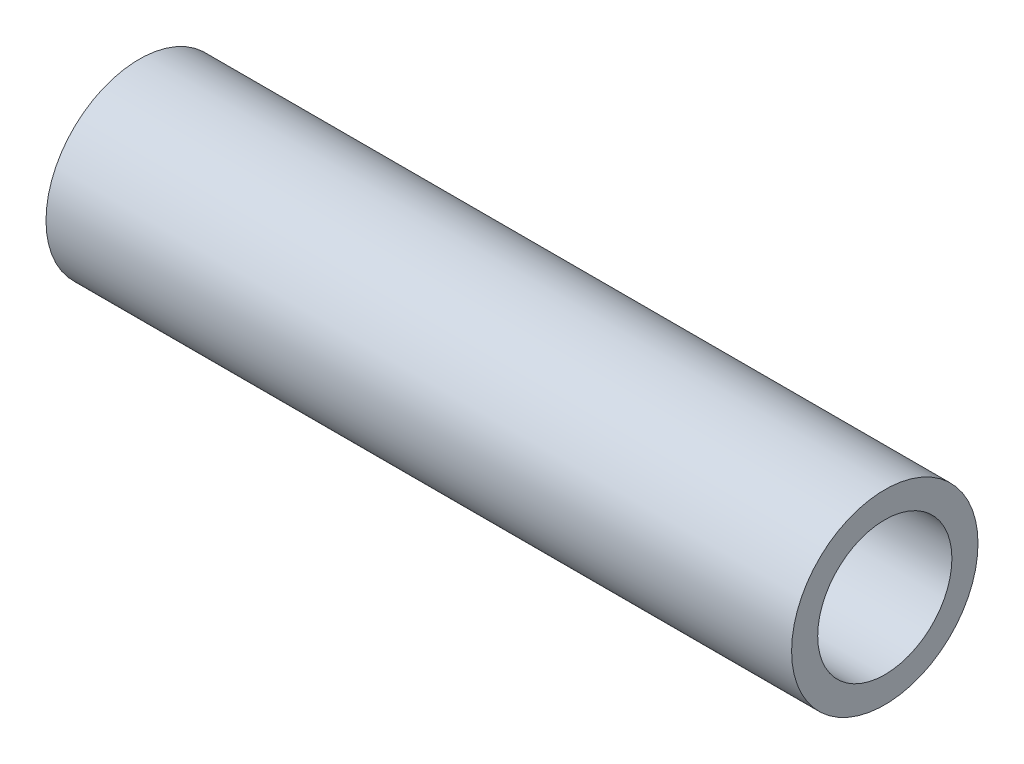
ISO-10303-21;
HEADER;
FILE_DESCRIPTION(('STEP AP214'),'2;1');
FILE_NAME('part.step','',(''),(''),'','','');
FILE_SCHEMA(('AUTOMOTIVE_DESIGN { 1 0 10303 214 1 1 1 1 }'));
ENDSEC;
DATA;
#1=APPLICATION_CONTEXT('core data for automotive mechanical design processes');
#2=APPLICATION_PROTOCOL_DEFINITION('international standard','automotive_design',2000,#1);
#3=PRODUCT_CONTEXT('',#1,'mechanical');
#4=PRODUCT('Part','Part','',(#3));
#5=PRODUCT_RELATED_PRODUCT_CATEGORY('part','',(#4));
#6=PRODUCT_DEFINITION_FORMATION('','',#4);
#7=PRODUCT_DEFINITION_CONTEXT('part definition',#1,'design');
#8=PRODUCT_DEFINITION('design','',#6,#7);
#9=PRODUCT_DEFINITION_SHAPE('','',#8);
#10=(LENGTH_UNIT() NAMED_UNIT(*) SI_UNIT(.MILLI.,.METRE.));
#11=(NAMED_UNIT(*) PLANE_ANGLE_UNIT() SI_UNIT($,.RADIAN.));
#12=(NAMED_UNIT(*) SI_UNIT($,.STERADIAN.) SOLID_ANGLE_UNIT());
#13=UNCERTAINTY_MEASURE_WITH_UNIT(LENGTH_MEASURE(1.E-05),#10,'distance_accuracy_value','');
#14=(GEOMETRIC_REPRESENTATION_CONTEXT(3) GLOBAL_UNCERTAINTY_ASSIGNED_CONTEXT((#13)) GLOBAL_UNIT_ASSIGNED_CONTEXT((#10,
#11,#12)) REPRESENTATION_CONTEXT('',''));
#15=CARTESIAN_POINT('',(0.,0.,0.));
#16=DIRECTION('',(0.,0.,1.));
#17=DIRECTION('',(1.,0.,0.));
#18=AXIS2_PLACEMENT_3D('',#15,#16,#17);
#19=CARTESIAN_POINT('',(20.,0.,0.));
#20=DIRECTION('',(-1.,0.,0.));
#21=DIRECTION('',(0.,0.,1.));
#22=AXIS2_PLACEMENT_3D('',#19,#20,#21);
#23=CYLINDRICAL_SURFACE('',#22,2.5);
#24=CARTESIAN_POINT('',(20.,0.,0.));
#25=DIRECTION('',(1.,0.,0.));
#26=DIRECTION('',(0.,0.,-1.));
#27=AXIS2_PLACEMENT_3D('',#24,#25,#26);
#28=CIRCLE('',#27,2.5);
#29=CARTESIAN_POINT('',(20.,0.,-2.5));
#30=VERTEX_POINT('',#29);
#31=EDGE_CURVE('E10',#30,#30,#28,.T.);
#32=ORIENTED_EDGE('',*,*,#31,.F.);
#33=EDGE_LOOP('',(#32));
#34=FACE_BOUND('',#33,.T.);
#35=CARTESIAN_POINT('',(0.,0.,0.));
#36=DIRECTION('',(1.,0.,0.));
#37=DIRECTION('',(0.,0.,-1.));
#38=AXIS2_PLACEMENT_3D('',#35,#36,#37);
#39=CIRCLE('',#38,2.5);
#40=CARTESIAN_POINT('',(0.,0.,-2.5));
#41=VERTEX_POINT('',#40);
#42=EDGE_CURVE('E40',#41,#41,#39,.T.);
#43=ORIENTED_EDGE('',*,*,#42,.T.);
#44=EDGE_LOOP('',(#43));
#45=FACE_BOUND('',#44,.T.);
#46=ADVANCED_FACE('F37',(#34,#45),#23,.T.);
#47=CARTESIAN_POINT('',(20.,0.,0.));
#48=DIRECTION('',(1.,0.,0.));
#49=DIRECTION('',(0.,0.,-1.));
#50=AXIS2_PLACEMENT_3D('',#47,#48,#49);
#51=PLANE('',#50);
#52=CARTESIAN_POINT('',(20.,0.,0.));
#53=DIRECTION('',(1.,0.,0.));
#54=DIRECTION('',(0.,0.,-1.));
#55=AXIS2_PLACEMENT_3D('',#52,#53,#54);
#56=CIRCLE('',#55,1.8);
#57=CARTESIAN_POINT('',(20.,0.,-1.8));
#58=VERTEX_POINT('',#57);
#59=EDGE_CURVE('E47',#58,#58,#56,.F.);
#60=ORIENTED_EDGE('',*,*,#59,.T.);
#61=EDGE_LOOP('',(#60));
#62=FACE_BOUND('',#61,.T.);
#63=ORIENTED_EDGE('',*,*,#31,.T.);
#64=EDGE_LOOP('',(#63));
#65=FACE_BOUND('',#64,.T.);
#66=ADVANCED_FACE('F61',(#62,#65),#51,.T.);
#67=CARTESIAN_POINT('',(0.,0.,0.));
#68=DIRECTION('',(1.,0.,0.));
#69=DIRECTION('',(0.,0.,-1.));
#70=AXIS2_PLACEMENT_3D('',#67,#68,#69);
#71=PLANE('',#70);
#72=CARTESIAN_POINT('',(0.,0.,0.));
#73=DIRECTION('',(-1.,0.,0.));
#74=DIRECTION('',(0.,0.,1.));
#75=AXIS2_PLACEMENT_3D('',#72,#73,#74);
#76=CIRCLE('',#75,1.8);
#77=CARTESIAN_POINT('',(0.,0.,1.8));
#78=VERTEX_POINT('',#77);
#79=EDGE_CURVE('E51',#78,#78,#76,.T.);
#80=ORIENTED_EDGE('',*,*,#79,.F.);
#81=EDGE_LOOP('',(#80));
#82=FACE_BOUND('',#81,.T.);
#83=ORIENTED_EDGE('',*,*,#42,.F.);
#84=EDGE_LOOP('',(#83));
#85=FACE_BOUND('',#84,.T.);
#86=ADVANCED_FACE('F58',(#82,#85),#71,.F.);
#87=CARTESIAN_POINT('',(25.0911688245431,0.,0.));
#88=DIRECTION('',(-1.,0.,0.));
#89=DIRECTION('',(0.,0.,1.));
#90=AXIS2_PLACEMENT_3D('',#87,#88,#89);
#91=CYLINDRICAL_SURFACE('',#90,1.8);
#92=ORIENTED_EDGE('',*,*,#79,.T.);
#93=EDGE_LOOP('',(#92));
#94=FACE_BOUND('',#93,.T.);
#95=ORIENTED_EDGE('',*,*,#59,.F.);
#96=EDGE_LOOP('',(#95));
#97=FACE_BOUND('',#96,.T.);
#98=ADVANCED_FACE('F55',(#94,#97),#91,.F.);
#99=CLOSED_SHELL('',(#46,#66,#86,#98));
#100=MANIFOLD_SOLID_BREP('B2',#99);
#101=ADVANCED_BREP_SHAPE_REPRESENTATION('',(#18,#100),#14);
#102=SHAPE_DEFINITION_REPRESENTATION(#9,#101);
ENDSEC;
END-ISO-10303-21;
